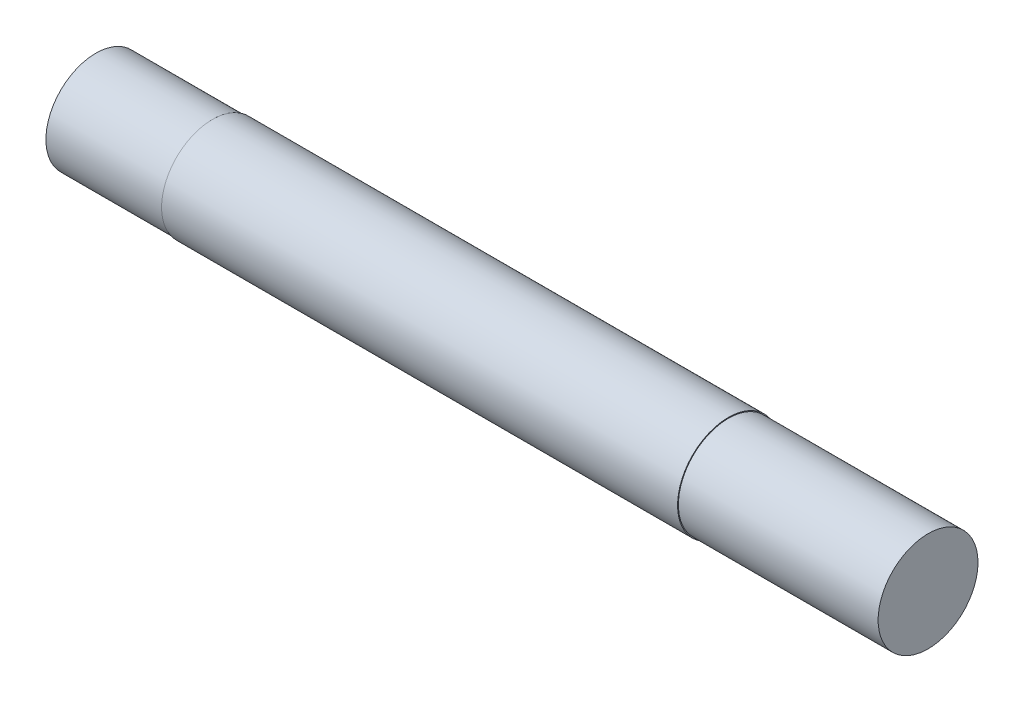
ISO-10303-21;
HEADER;
FILE_DESCRIPTION(('STEP AP214'),'2;1');
FILE_NAME('part.step','',(''),(''),'','','');
FILE_SCHEMA(('AUTOMOTIVE_DESIGN { 1 0 10303 214 1 1 1 1 }'));
ENDSEC;
DATA;
#1=APPLICATION_CONTEXT('core data for automotive mechanical design processes');
#2=APPLICATION_PROTOCOL_DEFINITION('international standard','automotive_design',2000,#1);
#3=PRODUCT_CONTEXT('',#1,'mechanical');
#4=PRODUCT('Part','Part','',(#3));
#5=PRODUCT_RELATED_PRODUCT_CATEGORY('part','',(#4));
#6=PRODUCT_DEFINITION_FORMATION('','',#4);
#7=PRODUCT_DEFINITION_CONTEXT('part definition',#1,'design');
#8=PRODUCT_DEFINITION('design','',#6,#7);
#9=PRODUCT_DEFINITION_SHAPE('','',#8);
#10=(LENGTH_UNIT() NAMED_UNIT(*) SI_UNIT(.MILLI.,.METRE.));
#11=(NAMED_UNIT(*) PLANE_ANGLE_UNIT() SI_UNIT($,.RADIAN.));
#12=(NAMED_UNIT(*) SI_UNIT($,.STERADIAN.) SOLID_ANGLE_UNIT());
#13=UNCERTAINTY_MEASURE_WITH_UNIT(LENGTH_MEASURE(1.E-05),#10,'distance_accuracy_value','');
#14=(GEOMETRIC_REPRESENTATION_CONTEXT(3) GLOBAL_UNCERTAINTY_ASSIGNED_CONTEXT((#13)) GLOBAL_UNIT_ASSIGNED_CONTEXT((#10,
#11,#12)) REPRESENTATION_CONTEXT('',''));
#15=CARTESIAN_POINT('',(0.,0.,0.));
#16=DIRECTION('',(0.,0.,1.));
#17=DIRECTION('',(1.,0.,0.));
#18=AXIS2_PLACEMENT_3D('',#15,#16,#17);
#19=CARTESIAN_POINT('',(0.,0.,0.));
#20=DIRECTION('',(-1.,0.,0.));
#21=DIRECTION('',(0.,0.,1.));
#22=AXIS2_PLACEMENT_3D('',#19,#20,#21);
#23=PLANE('',#22);
#24=CARTESIAN_POINT('',(0.,0.,0.));
#25=DIRECTION('',(1.,0.,0.));
#26=DIRECTION('',(0.,0.,-1.));
#27=AXIS2_PLACEMENT_3D('',#24,#25,#26);
#28=CIRCLE('',#27,3.);
#29=CARTESIAN_POINT('',(0.,0.,-3.));
#30=VERTEX_POINT('',#29);
#31=EDGE_CURVE('E10',#30,#30,#28,.T.);
#32=ORIENTED_EDGE('',*,*,#31,.F.);
#33=EDGE_LOOP('',(#32));
#34=FACE_BOUND('',#33,.T.);
#35=ADVANCED_FACE('F35',(#34),#23,.T.);
#36=CARTESIAN_POINT('',(0.,0.,0.));
#37=DIRECTION('',(1.,0.,0.));
#38=DIRECTION('',(0.,0.,-1.));
#39=AXIS2_PLACEMENT_3D('',#36,#37,#38);
#40=CYLINDRICAL_SURFACE('',#39,3.);
#41=ORIENTED_EDGE('',*,*,#31,.T.);
#42=EDGE_LOOP('',(#41));
#43=FACE_BOUND('',#42,.T.);
#44=CARTESIAN_POINT('',(7.,0.,0.));
#45=DIRECTION('',(1.,0.,0.));
#46=DIRECTION('',(0.,0.,-1.));
#47=AXIS2_PLACEMENT_3D('',#44,#45,#46);
#48=CIRCLE('',#47,3.);
#49=CARTESIAN_POINT('',(7.,0.,-3.));
#50=VERTEX_POINT('',#49);
#51=EDGE_CURVE('E41',#50,#50,#48,.T.);
#52=ORIENTED_EDGE('',*,*,#51,.F.);
#53=EDGE_LOOP('',(#52));
#54=FACE_BOUND('',#53,.T.);
#55=ADVANCED_FACE('F77',(#43,#54),#40,.T.);
#56=CARTESIAN_POINT('',(7.,0.,-3.));
#57=DIRECTION('',(-1.,0.,0.));
#58=DIRECTION('',(0.,0.,1.));
#59=AXIS2_PLACEMENT_3D('',#56,#57,#58);
#60=PLANE('',#59);
#61=ORIENTED_EDGE('',*,*,#51,.T.);
#62=EDGE_LOOP('',(#61));
#63=FACE_BOUND('',#62,.T.);
#64=CARTESIAN_POINT('',(7.,0.,0.));
#65=DIRECTION('',(1.,0.,0.));
#66=DIRECTION('',(0.,0.,-1.));
#67=AXIS2_PLACEMENT_3D('',#64,#65,#66);
#68=CIRCLE('',#67,3.05);
#69=CARTESIAN_POINT('',(7.,0.,-3.05));
#70=VERTEX_POINT('',#69);
#71=EDGE_CURVE('E45',#70,#70,#68,.T.);
#72=ORIENTED_EDGE('',*,*,#71,.F.);
#73=EDGE_LOOP('',(#72));
#74=FACE_BOUND('',#73,.T.);
#75=ADVANCED_FACE('F82',(#63,#74),#60,.T.);
#76=CARTESIAN_POINT('',(0.,0.,0.));
#77=DIRECTION('',(1.,0.,0.));
#78=DIRECTION('',(0.,0.,-1.));
#79=AXIS2_PLACEMENT_3D('',#76,#77,#78);
#80=CYLINDRICAL_SURFACE('',#79,3.05);
#81=ORIENTED_EDGE('',*,*,#71,.T.);
#82=EDGE_LOOP('',(#81));
#83=FACE_BOUND('',#82,.T.);
#84=CARTESIAN_POINT('',(38.,0.,0.));
#85=DIRECTION('',(1.,0.,0.));
#86=DIRECTION('',(0.,0.,-1.));
#87=AXIS2_PLACEMENT_3D('',#84,#85,#86);
#88=CIRCLE('',#87,3.05);
#89=CARTESIAN_POINT('',(38.,0.,-3.05));
#90=VERTEX_POINT('',#89);
#91=EDGE_CURVE('E49',#90,#90,#88,.T.);
#92=ORIENTED_EDGE('',*,*,#91,.F.);
#93=EDGE_LOOP('',(#92));
#94=FACE_BOUND('',#93,.T.);
#95=ADVANCED_FACE('F73',(#83,#94),#80,.T.);
#96=CARTESIAN_POINT('',(38.,0.,-3.));
#97=DIRECTION('',(1.,0.,0.));
#98=DIRECTION('',(0.,0.,-1.));
#99=AXIS2_PLACEMENT_3D('',#96,#97,#98);
#100=PLANE('',#99);
#101=ORIENTED_EDGE('',*,*,#91,.T.);
#102=EDGE_LOOP('',(#101));
#103=FACE_BOUND('',#102,.T.);
#104=CARTESIAN_POINT('',(38.,0.,0.));
#105=DIRECTION('',(1.,0.,0.));
#106=DIRECTION('',(0.,0.,-1.));
#107=AXIS2_PLACEMENT_3D('',#104,#105,#106);
#108=CIRCLE('',#107,3.);
#109=CARTESIAN_POINT('',(38.,0.,-3.));
#110=VERTEX_POINT('',#109);
#111=EDGE_CURVE('E54',#110,#110,#108,.T.);
#112=ORIENTED_EDGE('',*,*,#111,.F.);
#113=EDGE_LOOP('',(#112));
#114=FACE_BOUND('',#113,.T.);
#115=ADVANCED_FACE('F65',(#103,#114),#100,.T.);
#116=CARTESIAN_POINT('',(0.,0.,0.));
#117=DIRECTION('',(1.,0.,0.));
#118=DIRECTION('',(0.,0.,-1.));
#119=AXIS2_PLACEMENT_3D('',#116,#117,#118);
#120=CYLINDRICAL_SURFACE('',#119,3.);
#121=ORIENTED_EDGE('',*,*,#111,.T.);
#122=EDGE_LOOP('',(#121));
#123=FACE_BOUND('',#122,.T.);
#124=CARTESIAN_POINT('',(50.,0.,0.));
#125=DIRECTION('',(1.,0.,0.));
#126=DIRECTION('',(0.,0.,-1.));
#127=AXIS2_PLACEMENT_3D('',#124,#125,#126);
#128=CIRCLE('',#127,3.);
#129=CARTESIAN_POINT('',(50.,0.,-3.));
#130=VERTEX_POINT('',#129);
#131=EDGE_CURVE('E57',#130,#130,#128,.T.);
#132=ORIENTED_EDGE('',*,*,#131,.F.);
#133=EDGE_LOOP('',(#132));
#134=FACE_BOUND('',#133,.T.);
#135=ADVANCED_FACE('F63',(#123,#134),#120,.T.);
#136=CARTESIAN_POINT('',(50.,0.,0.));
#137=DIRECTION('',(1.,0.,0.));
#138=DIRECTION('',(0.,0.,-1.));
#139=AXIS2_PLACEMENT_3D('',#136,#137,#138);
#140=PLANE('',#139);
#141=ORIENTED_EDGE('',*,*,#131,.T.);
#142=EDGE_LOOP('',(#141));
#143=FACE_BOUND('',#142,.T.);
#144=ADVANCED_FACE('F61',(#143),#140,.T.);
#145=CLOSED_SHELL('',(#35,#55,#75,#95,#115,#135,#144));
#146=MANIFOLD_SOLID_BREP('B2',#145);
#147=ADVANCED_BREP_SHAPE_REPRESENTATION('',(#18,#146),#14);
#148=SHAPE_DEFINITION_REPRESENTATION(#9,#147);
ENDSEC;
END-ISO-10303-21;
